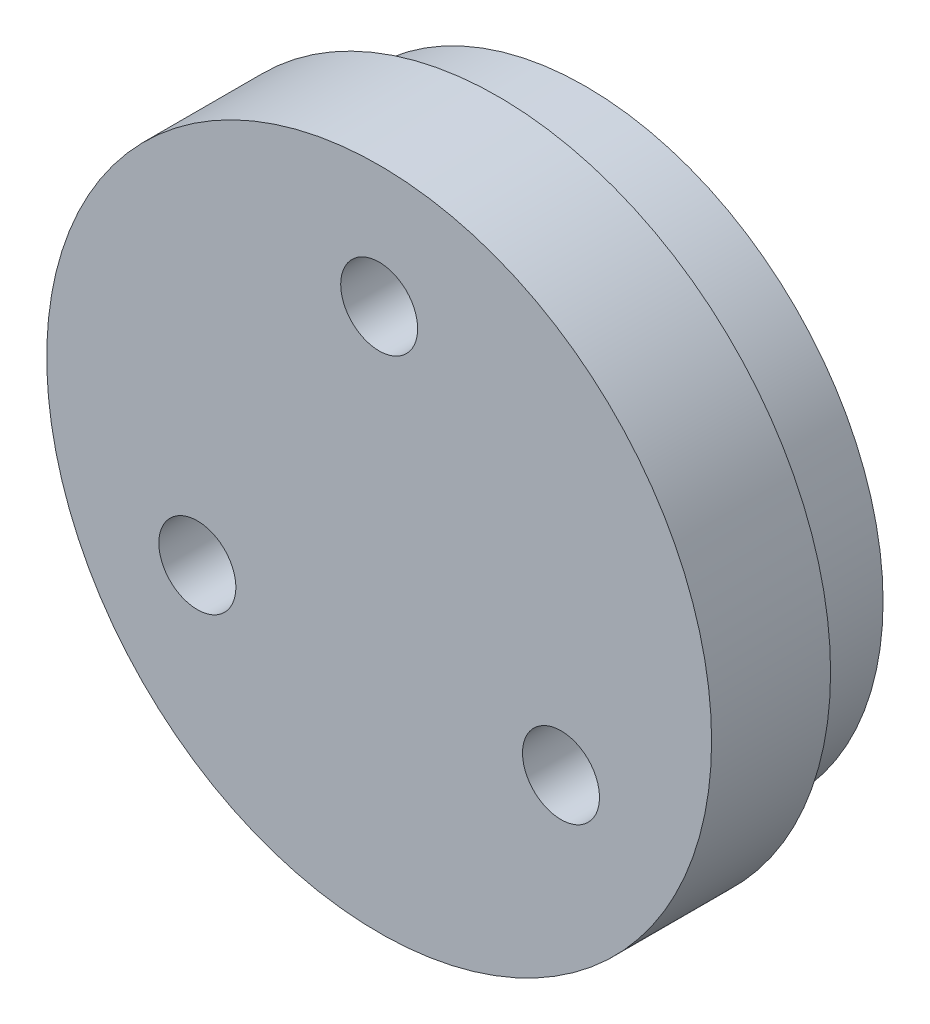
ISO-10303-21;
HEADER;
FILE_DESCRIPTION(('STEP AP214'),'2;1');
FILE_NAME('part.step','',(''),(''),'','','');
FILE_SCHEMA(('AUTOMOTIVE_DESIGN { 1 0 10303 214 1 1 1 1 }'));
ENDSEC;
DATA;
#1=APPLICATION_CONTEXT('core data for automotive mechanical design processes');
#2=APPLICATION_PROTOCOL_DEFINITION('international standard','automotive_design',2000,#1);
#3=PRODUCT_CONTEXT('',#1,'mechanical');
#4=PRODUCT('Part','Part','',(#3));
#5=PRODUCT_RELATED_PRODUCT_CATEGORY('part','',(#4));
#6=PRODUCT_DEFINITION_FORMATION('','',#4);
#7=PRODUCT_DEFINITION_CONTEXT('part definition',#1,'design');
#8=PRODUCT_DEFINITION('design','',#6,#7);
#9=PRODUCT_DEFINITION_SHAPE('','',#8);
#10=(LENGTH_UNIT() NAMED_UNIT(*) SI_UNIT(.MILLI.,.METRE.));
#11=(NAMED_UNIT(*) PLANE_ANGLE_UNIT() SI_UNIT($,.RADIAN.));
#12=(NAMED_UNIT(*) SI_UNIT($,.STERADIAN.) SOLID_ANGLE_UNIT());
#13=UNCERTAINTY_MEASURE_WITH_UNIT(LENGTH_MEASURE(1.E-05),#10,'distance_accuracy_value','');
#14=(GEOMETRIC_REPRESENTATION_CONTEXT(3) GLOBAL_UNCERTAINTY_ASSIGNED_CONTEXT((#13)) GLOBAL_UNIT_ASSIGNED_CONTEXT((#10,
#11,#12)) REPRESENTATION_CONTEXT('',''));
#15=CARTESIAN_POINT('',(0.,0.,0.));
#16=DIRECTION('',(0.,0.,1.));
#17=DIRECTION('',(1.,0.,0.));
#18=AXIS2_PLACEMENT_3D('',#15,#16,#17);
#19=CARTESIAN_POINT('',(0.,0.,2.5));
#20=DIRECTION('',(0.,0.,-1.));
#21=DIRECTION('',(-1.,0.,0.));
#22=AXIS2_PLACEMENT_3D('',#19,#20,#21);
#23=CYLINDRICAL_SURFACE('',#22,8.5);
#24=CARTESIAN_POINT('',(0.,0.,2.5));
#25=DIRECTION('',(0.,0.,1.));
#26=DIRECTION('',(1.,0.,0.));
#27=AXIS2_PLACEMENT_3D('',#24,#25,#26);
#28=CIRCLE('',#27,8.5);
#29=CARTESIAN_POINT('',(8.5,0.,2.5));
#30=VERTEX_POINT('',#29);
#31=EDGE_CURVE('E10',#30,#30,#28,.T.);
#32=ORIENTED_EDGE('',*,*,#31,.F.);
#33=EDGE_LOOP('',(#32));
#34=FACE_BOUND('',#33,.T.);
#35=CARTESIAN_POINT('',(0.,0.,0.));
#36=DIRECTION('',(0.,0.,1.));
#37=DIRECTION('',(1.,0.,0.));
#38=AXIS2_PLACEMENT_3D('',#35,#36,#37);
#39=CIRCLE('',#38,8.5);
#40=CARTESIAN_POINT('',(8.5,0.,0.));
#41=VERTEX_POINT('',#40);
#42=EDGE_CURVE('E34',#41,#41,#39,.T.);
#43=ORIENTED_EDGE('',*,*,#42,.T.);
#44=EDGE_LOOP('',(#43));
#45=FACE_BOUND('',#44,.T.);
#46=ADVANCED_FACE('F31',(#34,#45),#23,.T.);
#47=CARTESIAN_POINT('',(0.,0.,0.));
#48=DIRECTION('',(0.,0.,1.));
#49=DIRECTION('',(1.,0.,0.));
#50=AXIS2_PLACEMENT_3D('',#47,#48,#49);
#51=PLANE('',#50);
#52=CARTESIAN_POINT('',(0.,6.,0.));
#53=DIRECTION('',(0.,0.,-1.));
#54=DIRECTION('',(-1.,0.,0.));
#55=AXIS2_PLACEMENT_3D('',#52,#53,#54);
#56=CIRCLE('',#55,1.1);
#57=CARTESIAN_POINT('',(-1.1,6.,0.));
#58=VERTEX_POINT('',#57);
#59=EDGE_CURVE('E61',#58,#58,#56,.T.);
#60=ORIENTED_EDGE('',*,*,#59,.F.);
#61=EDGE_LOOP('',(#60));
#62=FACE_BOUND('',#61,.T.);
#63=CARTESIAN_POINT('',(-5.19615242270663,-3.,0.));
#64=DIRECTION('',(0.,0.,-1.));
#65=DIRECTION('',(-1.,0.,0.));
#66=AXIS2_PLACEMENT_3D('',#63,#64,#65);
#67=CIRCLE('',#66,1.1);
#68=CARTESIAN_POINT('',(-6.29615242270663,-3.,0.));
#69=VERTEX_POINT('',#68);
#70=EDGE_CURVE('E55',#69,#69,#67,.T.);
#71=ORIENTED_EDGE('',*,*,#70,.F.);
#72=EDGE_LOOP('',(#71));
#73=FACE_BOUND('',#72,.T.);
#74=CARTESIAN_POINT('',(5.19615242270663,-3.,0.));
#75=DIRECTION('',(0.,0.,-1.));
#76=DIRECTION('',(-1.,0.,0.));
#77=AXIS2_PLACEMENT_3D('',#74,#75,#76);
#78=CIRCLE('',#77,1.1);
#79=CARTESIAN_POINT('',(4.09615242270663,-3.,0.));
#80=VERTEX_POINT('',#79);
#81=EDGE_CURVE('E49',#80,#80,#78,.T.);
#82=ORIENTED_EDGE('',*,*,#81,.F.);
#83=EDGE_LOOP('',(#82));
#84=FACE_BOUND('',#83,.T.);
#85=ORIENTED_EDGE('',*,*,#42,.F.);
#86=EDGE_LOOP('',(#85));
#87=FACE_BOUND('',#86,.T.);
#88=ADVANCED_FACE('F77',(#62,#73,#84,#87),#51,.F.);
#89=CARTESIAN_POINT('',(0.,0.,5.9));
#90=DIRECTION('',(0.,0.,-1.));
#91=DIRECTION('',(-1.,0.,0.));
#92=AXIS2_PLACEMENT_3D('',#89,#90,#91);
#93=CYLINDRICAL_SURFACE('',#92,9.5);
#94=CARTESIAN_POINT('',(0.,0.,5.9));
#95=DIRECTION('',(0.,0.,1.));
#96=DIRECTION('',(1.,0.,0.));
#97=AXIS2_PLACEMENT_3D('',#94,#95,#96);
#98=CIRCLE('',#97,9.5);
#99=CARTESIAN_POINT('',(9.5,0.,5.9));
#100=VERTEX_POINT('',#99);
#101=EDGE_CURVE('E41',#100,#100,#98,.T.);
#102=ORIENTED_EDGE('',*,*,#101,.F.);
#103=EDGE_LOOP('',(#102));
#104=FACE_BOUND('',#103,.T.);
#105=CARTESIAN_POINT('',(0.,0.,2.5));
#106=DIRECTION('',(0.,0.,1.));
#107=DIRECTION('',(1.,0.,0.));
#108=AXIS2_PLACEMENT_3D('',#105,#106,#107);
#109=CIRCLE('',#108,9.5);
#110=CARTESIAN_POINT('',(9.5,0.,2.5));
#111=VERTEX_POINT('',#110);
#112=EDGE_CURVE('E43',#111,#111,#109,.T.);
#113=ORIENTED_EDGE('',*,*,#112,.T.);
#114=EDGE_LOOP('',(#113));
#115=FACE_BOUND('',#114,.T.);
#116=ADVANCED_FACE('F80',(#104,#115),#93,.T.);
#117=CARTESIAN_POINT('',(0.,0.,5.9));
#118=DIRECTION('',(0.,0.,1.));
#119=DIRECTION('',(1.,0.,0.));
#120=AXIS2_PLACEMENT_3D('',#117,#118,#119);
#121=PLANE('',#120);
#122=CARTESIAN_POINT('',(0.,6.,5.9));
#123=DIRECTION('',(0.,0.,-1.));
#124=DIRECTION('',(-1.,0.,0.));
#125=AXIS2_PLACEMENT_3D('',#122,#123,#124);
#126=CIRCLE('',#125,1.1);
#127=CARTESIAN_POINT('',(-1.1,6.,5.9));
#128=VERTEX_POINT('',#127);
#129=EDGE_CURVE('E46',#128,#128,#126,.T.);
#130=ORIENTED_EDGE('',*,*,#129,.T.);
#131=EDGE_LOOP('',(#130));
#132=FACE_BOUND('',#131,.T.);
#133=CARTESIAN_POINT('',(-5.19615242270663,-3.,5.9));
#134=DIRECTION('',(0.,0.,-1.));
#135=DIRECTION('',(-1.,0.,0.));
#136=AXIS2_PLACEMENT_3D('',#133,#134,#135);
#137=CIRCLE('',#136,1.1);
#138=CARTESIAN_POINT('',(-6.29615242270663,-3.,5.9));
#139=VERTEX_POINT('',#138);
#140=EDGE_CURVE('E58',#139,#139,#137,.T.);
#141=ORIENTED_EDGE('',*,*,#140,.T.);
#142=EDGE_LOOP('',(#141));
#143=FACE_BOUND('',#142,.T.);
#144=CARTESIAN_POINT('',(5.19615242270663,-3.,5.9));
#145=DIRECTION('',(0.,0.,-1.));
#146=DIRECTION('',(-1.,0.,0.));
#147=AXIS2_PLACEMENT_3D('',#144,#145,#146);
#148=CIRCLE('',#147,1.1);
#149=CARTESIAN_POINT('',(4.09615242270663,-3.,5.9));
#150=VERTEX_POINT('',#149);
#151=EDGE_CURVE('E52',#150,#150,#148,.T.);
#152=ORIENTED_EDGE('',*,*,#151,.T.);
#153=EDGE_LOOP('',(#152));
#154=FACE_BOUND('',#153,.T.);
#155=ORIENTED_EDGE('',*,*,#101,.T.);
#156=EDGE_LOOP('',(#155));
#157=FACE_BOUND('',#156,.T.);
#158=ADVANCED_FACE('F67',(#132,#143,#154,#157),#121,.T.);
#159=CARTESIAN_POINT('',(0.,0.,2.5));
#160=DIRECTION('',(0.,0.,1.));
#161=DIRECTION('',(1.,0.,0.));
#162=AXIS2_PLACEMENT_3D('',#159,#160,#161);
#163=PLANE('',#162);
#164=ORIENTED_EDGE('',*,*,#31,.T.);
#165=EDGE_LOOP('',(#164));
#166=FACE_BOUND('',#165,.T.);
#167=ORIENTED_EDGE('',*,*,#112,.F.);
#168=EDGE_LOOP('',(#167));
#169=FACE_BOUND('',#168,.T.);
#170=ADVANCED_FACE('F112',(#166,#169),#163,.F.);
#171=CARTESIAN_POINT('',(5.19615242270663,-3.,5.9));
#172=DIRECTION('',(0.,0.,-1.));
#173=DIRECTION('',(-1.,0.,0.));
#174=AXIS2_PLACEMENT_3D('',#171,#172,#173);
#175=CYLINDRICAL_SURFACE('',#174,1.1);
#176=ORIENTED_EDGE('',*,*,#151,.F.);
#177=EDGE_LOOP('',(#176));
#178=FACE_BOUND('',#177,.T.);
#179=ORIENTED_EDGE('',*,*,#81,.T.);
#180=EDGE_LOOP('',(#179));
#181=FACE_BOUND('',#180,.T.);
#182=ADVANCED_FACE('F121',(#178,#181),#175,.F.);
#183=CARTESIAN_POINT('',(-5.19615242270663,-3.,5.9));
#184=DIRECTION('',(0.,0.,-1.));
#185=DIRECTION('',(-1.,0.,0.));
#186=AXIS2_PLACEMENT_3D('',#183,#184,#185);
#187=CYLINDRICAL_SURFACE('',#186,1.1);
#188=ORIENTED_EDGE('',*,*,#140,.F.);
#189=EDGE_LOOP('',(#188));
#190=FACE_BOUND('',#189,.T.);
#191=ORIENTED_EDGE('',*,*,#70,.T.);
#192=EDGE_LOOP('',(#191));
#193=FACE_BOUND('',#192,.T.);
#194=ADVANCED_FACE('F73',(#190,#193),#187,.F.);
#195=CARTESIAN_POINT('',(0.,6.,5.9));
#196=DIRECTION('',(0.,0.,-1.));
#197=DIRECTION('',(-1.,0.,0.));
#198=AXIS2_PLACEMENT_3D('',#195,#196,#197);
#199=CYLINDRICAL_SURFACE('',#198,1.1);
#200=ORIENTED_EDGE('',*,*,#129,.F.);
#201=EDGE_LOOP('',(#200));
#202=FACE_BOUND('',#201,.T.);
#203=ORIENTED_EDGE('',*,*,#59,.T.);
#204=EDGE_LOOP('',(#203));
#205=FACE_BOUND('',#204,.T.);
#206=ADVANCED_FACE('F70',(#202,#205),#199,.F.);
#207=CLOSED_SHELL('',(#46,#88,#116,#158,#170,#182,#194,#206));
#208=MANIFOLD_SOLID_BREP('B2',#207);
#209=ADVANCED_BREP_SHAPE_REPRESENTATION('',(#18,#208),#14);
#210=SHAPE_DEFINITION_REPRESENTATION(#9,#209);
ENDSEC;
END-ISO-10303-21;
